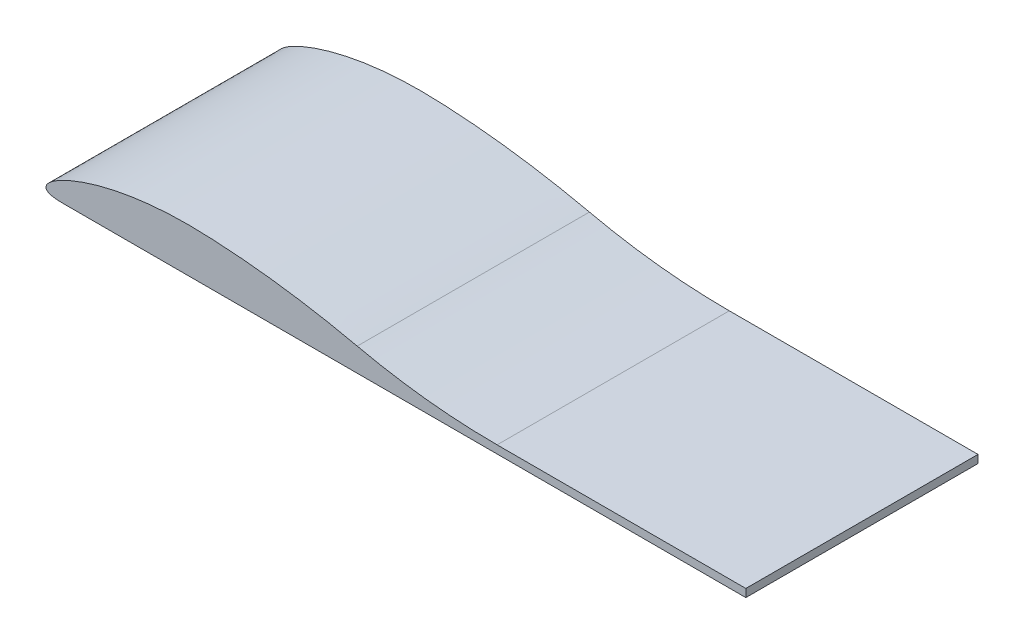
ISO-10303-21;
HEADER;
FILE_DESCRIPTION(('STEP AP214'),'2;1');
FILE_NAME('part.step','',(''),(''),'','','');
FILE_SCHEMA(('AUTOMOTIVE_DESIGN { 1 0 10303 214 1 1 1 1 }'));
ENDSEC;
DATA;
#1=APPLICATION_CONTEXT('core data for automotive mechanical design processes');
#2=APPLICATION_PROTOCOL_DEFINITION('international standard','automotive_design',2000,#1);
#3=PRODUCT_CONTEXT('',#1,'mechanical');
#4=PRODUCT('Part','Part','',(#3));
#5=PRODUCT_RELATED_PRODUCT_CATEGORY('part','',(#4));
#6=PRODUCT_DEFINITION_FORMATION('','',#4);
#7=PRODUCT_DEFINITION_CONTEXT('part definition',#1,'design');
#8=PRODUCT_DEFINITION('design','',#6,#7);
#9=PRODUCT_DEFINITION_SHAPE('','',#8);
#10=(LENGTH_UNIT() NAMED_UNIT(*) SI_UNIT(.MILLI.,.METRE.));
#11=(NAMED_UNIT(*) PLANE_ANGLE_UNIT() SI_UNIT($,.RADIAN.));
#12=(NAMED_UNIT(*) SI_UNIT($,.STERADIAN.) SOLID_ANGLE_UNIT());
#13=UNCERTAINTY_MEASURE_WITH_UNIT(LENGTH_MEASURE(1.E-05),#10,'distance_accuracy_value','');
#14=(GEOMETRIC_REPRESENTATION_CONTEXT(3) GLOBAL_UNCERTAINTY_ASSIGNED_CONTEXT((#13)) GLOBAL_UNIT_ASSIGNED_CONTEXT((#10,
#11,#12)) REPRESENTATION_CONTEXT('',''));
#15=CARTESIAN_POINT('',(0.,0.,0.));
#16=DIRECTION('',(0.,0.,1.));
#17=DIRECTION('',(1.,0.,0.));
#18=AXIS2_PLACEMENT_3D('',#15,#16,#17);
#19=CARTESIAN_POINT('',(0.,2.69535336919036,185.42));
#20=DIRECTION('',(0.,-1.,0.));
#21=DIRECTION('',(1.,0.,0.));
#22=AXIS2_PLACEMENT_3D('',#19,#20,#21);
#23=PLANE('',#22);
#24=DIRECTION('',(-1.,0.,0.));
#25=VECTOR('',#24,1.);
#26=CARTESIAN_POINT('',(0.,2.69535336919036,0.));
#27=LINE('',#26,#25);
#28=CARTESIAN_POINT('',(558.8,2.69535336919067,0.));
#29=VERTEX_POINT('',#28);
#30=CARTESIAN_POINT('',(360.180421151928,2.69535336919056,0.));
#31=VERTEX_POINT('',#30);
#32=EDGE_CURVE('E114',#29,#31,#27,.T.);
#33=ORIENTED_EDGE('',*,*,#32,.T.);
#34=DIRECTION('',(0.,0.,1.));
#35=VECTOR('',#34,1.);
#36=CARTESIAN_POINT('',(360.180421151928,2.69535336919056,185.42));
#37=LINE('',#36,#35);
#38=CARTESIAN_POINT('',(360.180421151928,2.69535336919056,185.42));
#39=VERTEX_POINT('',#38);
#40=EDGE_CURVE('E50',#31,#39,#37,.T.);
#41=ORIENTED_EDGE('',*,*,#40,.T.);
#42=DIRECTION('',(-1.,0.,0.));
#43=VECTOR('',#42,1.);
#44=CARTESIAN_POINT('',(0.,2.69535336919036,185.42));
#45=LINE('',#44,#43);
#46=CARTESIAN_POINT('',(558.8,2.69535336919067,185.42));
#47=VERTEX_POINT('',#46);
#48=EDGE_CURVE('E91',#47,#39,#45,.T.);
#49=ORIENTED_EDGE('',*,*,#48,.F.);
#50=DIRECTION('',(0.,0.,-1.));
#51=VECTOR('',#50,1.);
#52=CARTESIAN_POINT('',(558.8,2.69535336919067,185.42));
#53=LINE('',#52,#51);
#54=EDGE_CURVE('E107',#47,#29,#53,.T.);
#55=ORIENTED_EDGE('',*,*,#54,.T.);
#56=EDGE_LOOP('',(#33,#41,#49,#55));
#57=FACE_BOUND('',#56,.T.);
#58=ADVANCED_FACE('F35',(#57),#23,.F.);
#59=CARTESIAN_POINT('',(304.8,0.,185.42));
#60=CARTESIAN_POINT('',(304.806765113415,0.0297936907438,185.42));
#61=CARTESIAN_POINT('',(303.042265442166,0.505757681104882,185.42));
#62=CARTESIAN_POINT('',(301.260699107524,1.13128828679422,185.42));
#63=CARTESIAN_POINT('',(296.859481645383,2.43138214292342,185.42));
#64=CARTESIAN_POINT('',(291.428347563501,4.05950750692163,185.42));
#65=CARTESIAN_POINT('',(284.271481229636,6.10623828707882,185.42));
#66=CARTESIAN_POINT('',(275.759062516084,8.44101190552645,185.42));
#67=CARTESIAN_POINT('',(265.867595029522,11.0139121726236,185.42));
#68=CARTESIAN_POINT('',(254.72828410266,13.7239516275996,185.42));
#69=CARTESIAN_POINT('',(242.45219776627,16.501342019607,185.42));
#70=CARTESIAN_POINT('',(229.161916522714,19.2494538440017,185.42));
#71=CARTESIAN_POINT('',(215.002240334106,21.8918598082205,185.42));
#72=CARTESIAN_POINT('',(200.122077246214,24.3476644337164,185.42));
#73=CARTESIAN_POINT('',(184.681833301631,26.5449418917091,185.42));
#74=CARTESIAN_POINT('',(168.851714947921,28.4233907056108,185.42));
#75=CARTESIAN_POINT('',(152.808183208541,29.930661937332,185.42));
#76=CARTESIAN_POINT('',(136.726583628561,31.0048710051825,185.42));
#77=CARTESIAN_POINT('',(120.705050439528,31.6889083800929,185.42));
#78=CARTESIAN_POINT('',(104.91367571592,31.6961733177902,185.42));
#79=CARTESIAN_POINT('',(89.5648924045714,30.8862286831657,185.42));
#80=CARTESIAN_POINT('',(74.9378034426248,29.3709102924395,185.42));
#81=CARTESIAN_POINT('',(61.2207309550213,27.2233169079844,185.42));
#82=CARTESIAN_POINT('',(48.5867513337238,24.5540455106148,185.42));
#83=CARTESIAN_POINT('',(37.1861333906392,21.5011014723962,185.42));
#84=CARTESIAN_POINT('',(27.1552746614983,18.1970778873359,185.42));
#85=CARTESIAN_POINT('',(18.5969283006425,14.8044671458805,185.42));
#86=CARTESIAN_POINT('',(11.6063717286755,11.4360388322654,185.42));
#87=CARTESIAN_POINT('',(6.20537461581932,8.26316028915888,185.42));
#88=CARTESIAN_POINT('',(2.4620711553724,5.3102193566351,185.42));
#89=CARTESIAN_POINT('',(0.172825892274397,2.71807809904705,185.42));
#90=CARTESIAN_POINT('',(-0.366692026212387,-0.106725709936372,185.42));
#91=CARTESIAN_POINT('',(1.61853864418734,-2.17519153343636,185.42));
#92=CARTESIAN_POINT('',(4.90312913802598,-3.1117877974165,185.42));
#93=CARTESIAN_POINT('',(9.54050066961738,-3.65904451106276,185.42));
#94=CARTESIAN_POINT('',(15.6223250235567,-3.68468011379504,185.42));
#95=CARTESIAN_POINT('',(23.0877165309997,-3.30949507157914,185.42));
#96=CARTESIAN_POINT('',(31.8617424793389,-2.56072504363965,185.42));
#97=CARTESIAN_POINT('',(41.8437098749915,-1.53618962834286,185.42));
#98=CARTESIAN_POINT('',(52.9319861205823,-0.324549042889645,185.42));
#99=CARTESIAN_POINT('',(65.0085126482625,0.982737612858198,185.42));
#100=CARTESIAN_POINT('',(77.9641225568185,2.27751163277432,185.42));
#101=CARTESIAN_POINT('',(91.6740314858693,3.44660128053989,185.42));
#102=CARTESIAN_POINT('',(106.020407657375,4.41212483885966,185.42));
#103=CARTESIAN_POINT('',(120.95534562256,5.05177624345621,185.42));
#104=CARTESIAN_POINT('',(136.33914130998,5.41029723383236,185.42));
#105=CARTESIAN_POINT('',(152.007716340095,5.72933017095042,185.42));
#106=CARTESIAN_POINT('',(167.715786189237,5.89135553497832,185.42));
#107=CARTESIAN_POINT('',(183.286749282816,5.90781947795733,185.42));
#108=CARTESIAN_POINT('',(198.553027184666,5.75950083301546,185.42));
#109=CARTESIAN_POINT('',(213.347799024157,5.45737661505621,185.42));
#110=CARTESIAN_POINT('',(227.508384673819,5.01338248731081,185.42));
#111=CARTESIAN_POINT('',(240.877077650288,4.45854649480439,185.42));
#112=CARTESIAN_POINT('',(253.302348041566,3.81956254234677,185.42));
#113=CARTESIAN_POINT('',(264.636493620716,3.14064435260617,185.42));
#114=CARTESIAN_POINT('',(274.759317931257,2.45167335072776,185.42));
#115=CARTESIAN_POINT('',(283.511762664263,1.80333800911344,185.42));
#116=CARTESIAN_POINT('',(290.902443864489,1.20739442477992,185.42));
#117=CARTESIAN_POINT('',(296.536660630331,0.742433739926797,185.42));
#118=CARTESIAN_POINT('',(301.097723541562,0.310240549260641,185.42));
#119=CARTESIAN_POINT('',(302.984341567181,0.206591885939164,185.42));
#120=CARTESIAN_POINT('',(304.793276654245,-0.0296097451566188,185.42));
#121=CARTESIAN_POINT('',(304.8,0.,185.42));
#122=B_SPLINE_CURVE_WITH_KNOTS('',3,(#59,#60,#61,#62,#63,#64,#65,#66,#67,#68,#69,#70,#71,#72,
#73,#74,#75,#76,#77,#78,#79,#80,#81,#82,#83,#84,#85,#86,#87,#88,#89,#90,#91,#92,#93,#94,#95,#96,
#97,#98,#99,#100,#101,#102,#103,#104,#105,#106,#107,#108,#109,#110,#111,#112,#113,#114,#115,
#116,#117,#118,#119,#120,#121),.UNSPECIFIED.,.T.,.F.,(4,1,1,1,1,1,1,1,1,1,1,1,1,1,1,1,1,1,1,1,1,
1,1,1,1,1,1,1,1,1,1,1,1,1,1,1,1,1,1,1,1,1,1,1,1,1,1,1,1,1,1,1,1,1,1,1,1,1,1,1,4),(0.,
0.00137455348322331,0.00548449728179396,0.0122733609908927,0.021682195504866,0.0335806119079948,
0.0478307427867091,0.0643059527211734,0.082777332043007,0.103063756455997,0.124929016786915,
0.148149110667858,0.172444694611559,0.197572105868171,0.223268880537162,0.249227774933554,
0.275186209349679,0.300900708934774,0.326462938278696,0.351222485186767,0.374905858971967,
0.397269706218861,0.418072413969665,0.437079533175026,0.454093093767394,0.468919631578705,
0.48139171235289,0.491447126518173,0.499023571234557,0.504293734329401,0.507921918342,
0.511539686153778,0.516780527527172,0.524216490268905,0.533991629403711,0.546033957270731,
0.560220284382465,0.576403357410148,0.594370816485922,0.613951103581465,0.634916884969972,
0.657088503485648,0.680229909573905,0.704175481107386,0.72909036740664,0.754353775526935,
0.779667752347888,0.804760119952374,0.829359338708984,0.853208710008459,0.876041363199166,
0.897604065496152,0.917662212410958,0.935969860405553,0.952309787739252,0.966502759006892,
0.978350082728452,0.987731492337842,0.994510920242662,0.998633932979557,1.),.UNSPECIFIED.);
#123=DIRECTION('',(0.,0.,-1.));
#124=VECTOR('',#123,1.);
#125=SURFACE_OF_LINEAR_EXTRUSION('',#122,#124);
#126=CARTESIAN_POINT('',(248.468052126159,15.1306788748813,185.42));
#127=VERTEX_POINT('',#126);
#128=CARTESIAN_POINT('',(13.1611152527335,-3.65464663080947,185.42));
#129=VERTEX_POINT('',#128);
#130=EDGE_CURVE('E81',#127,#129,#122,.T.);
#131=ORIENTED_EDGE('',*,*,#130,.F.);
#132=DIRECTION('',(0.,0.,-1.));
#133=VECTOR('',#132,1.);
#134=CARTESIAN_POINT('',(248.468052126159,15.1306788748814,185.42));
#135=LINE('',#134,#133);
#136=CARTESIAN_POINT('',(248.468052126159,15.1306788748813,0.));
#137=VERTEX_POINT('',#136);
#138=EDGE_CURVE('E99',#127,#137,#135,.T.);
#139=ORIENTED_EDGE('',*,*,#138,.T.);
#140=CARTESIAN_POINT('',(304.8,0.,0.));
#141=CARTESIAN_POINT('',(304.806765113415,0.0297936907438,0.));
#142=CARTESIAN_POINT('',(303.042265442166,0.505757681104882,0.));
#143=CARTESIAN_POINT('',(301.260699107524,1.13128828679422,0.));
#144=CARTESIAN_POINT('',(296.859481645383,2.43138214292342,0.));
#145=CARTESIAN_POINT('',(291.428347563501,4.05950750692163,0.));
#146=CARTESIAN_POINT('',(284.271481229636,6.10623828707882,0.));
#147=CARTESIAN_POINT('',(275.759062516084,8.44101190552645,0.));
#148=CARTESIAN_POINT('',(265.867595029522,11.0139121726236,0.));
#149=CARTESIAN_POINT('',(254.72828410266,13.7239516275996,0.));
#150=CARTESIAN_POINT('',(242.45219776627,16.501342019607,0.));
#151=CARTESIAN_POINT('',(229.161916522714,19.2494538440017,0.));
#152=CARTESIAN_POINT('',(215.002240334106,21.8918598082205,0.));
#153=CARTESIAN_POINT('',(200.122077246214,24.3476644337164,0.));
#154=CARTESIAN_POINT('',(184.681833301631,26.5449418917091,0.));
#155=CARTESIAN_POINT('',(168.851714947921,28.4233907056108,0.));
#156=CARTESIAN_POINT('',(152.808183208541,29.930661937332,0.));
#157=CARTESIAN_POINT('',(136.726583628561,31.0048710051825,0.));
#158=CARTESIAN_POINT('',(120.705050439528,31.6889083800929,0.));
#159=CARTESIAN_POINT('',(104.91367571592,31.6961733177902,0.));
#160=CARTESIAN_POINT('',(89.5648924045714,30.8862286831657,0.));
#161=CARTESIAN_POINT('',(74.9378034426248,29.3709102924395,0.));
#162=CARTESIAN_POINT('',(61.2207309550213,27.2233169079844,0.));
#163=CARTESIAN_POINT('',(48.5867513337238,24.5540455106148,0.));
#164=CARTESIAN_POINT('',(37.1861333906392,21.5011014723962,0.));
#165=CARTESIAN_POINT('',(27.1552746614983,18.1970778873359,0.));
#166=CARTESIAN_POINT('',(18.5969283006425,14.8044671458805,0.));
#167=CARTESIAN_POINT('',(11.6063717286755,11.4360388322654,0.));
#168=CARTESIAN_POINT('',(6.20537461581932,8.26316028915888,0.));
#169=CARTESIAN_POINT('',(2.4620711553724,5.3102193566351,0.));
#170=CARTESIAN_POINT('',(0.172825892274397,2.71807809904705,0.));
#171=CARTESIAN_POINT('',(-0.366692026212387,-0.106725709936372,0.));
#172=CARTESIAN_POINT('',(1.61853864418734,-2.17519153343636,0.));
#173=CARTESIAN_POINT('',(4.90312913802598,-3.1117877974165,0.));
#174=CARTESIAN_POINT('',(9.54050066961738,-3.65904451106276,0.));
#175=CARTESIAN_POINT('',(15.6223250235567,-3.68468011379504,0.));
#176=CARTESIAN_POINT('',(23.0877165309997,-3.30949507157914,0.));
#177=CARTESIAN_POINT('',(31.8617424793389,-2.56072504363965,0.));
#178=CARTESIAN_POINT('',(41.8437098749915,-1.53618962834286,0.));
#179=CARTESIAN_POINT('',(52.9319861205823,-0.324549042889645,0.));
#180=CARTESIAN_POINT('',(65.0085126482625,0.982737612858198,0.));
#181=CARTESIAN_POINT('',(77.9641225568185,2.27751163277432,0.));
#182=CARTESIAN_POINT('',(91.6740314858693,3.44660128053989,0.));
#183=CARTESIAN_POINT('',(106.020407657375,4.41212483885966,0.));
#184=CARTESIAN_POINT('',(120.95534562256,5.05177624345621,0.));
#185=CARTESIAN_POINT('',(136.33914130998,5.41029723383236,0.));
#186=CARTESIAN_POINT('',(152.007716340095,5.72933017095042,0.));
#187=CARTESIAN_POINT('',(167.715786189237,5.89135553497832,0.));
#188=CARTESIAN_POINT('',(183.286749282816,5.90781947795733,0.));
#189=CARTESIAN_POINT('',(198.553027184666,5.75950083301546,0.));
#190=CARTESIAN_POINT('',(213.347799024157,5.45737661505621,0.));
#191=CARTESIAN_POINT('',(227.508384673819,5.01338248731081,0.));
#192=CARTESIAN_POINT('',(240.877077650288,4.45854649480439,0.));
#193=CARTESIAN_POINT('',(253.302348041566,3.81956254234677,0.));
#194=CARTESIAN_POINT('',(264.636493620716,3.14064435260617,0.));
#195=CARTESIAN_POINT('',(274.759317931257,2.45167335072776,0.));
#196=CARTESIAN_POINT('',(283.511762664263,1.80333800911344,0.));
#197=CARTESIAN_POINT('',(290.902443864489,1.20739442477992,0.));
#198=CARTESIAN_POINT('',(296.536660630331,0.742433739926797,0.));
#199=CARTESIAN_POINT('',(301.097723541562,0.310240549260641,0.));
#200=CARTESIAN_POINT('',(302.984341567181,0.206591885939164,0.));
#201=CARTESIAN_POINT('',(304.793276654245,-0.0296097451566188,0.));
#202=CARTESIAN_POINT('',(304.8,0.,0.));
#203=B_SPLINE_CURVE_WITH_KNOTS('',3,(#140,#141,#142,#143,#144,#145,#146,#147,#148,#149,#150,
#151,#152,#153,#154,#155,#156,#157,#158,#159,#160,#161,#162,#163,#164,#165,#166,#167,#168,#169,
#170,#171,#172,#173,#174,#175,#176,#177,#178,#179,#180,#181,#182,#183,#184,#185,#186,#187,#188,
#189,#190,#191,#192,#193,#194,#195,#196,#197,#198,#199,#200,#201,#202),.UNSPECIFIED.,.T.,.F.,(4,
1,1,1,1,1,1,1,1,1,1,1,1,1,1,1,1,1,1,1,1,1,1,1,1,1,1,1,1,1,1,1,1,1,1,1,1,1,1,1,1,1,1,1,1,1,1,1,1,
1,1,1,1,1,1,1,1,1,1,1,4),(0.,0.00137455348322331,0.00548449728179396,0.0122733609908927,
0.021682195504866,0.0335806119079948,0.0478307427867091,0.0643059527211734,0.082777332043007,
0.103063756455997,0.124929016786915,0.148149110667858,0.172444694611559,0.197572105868171,
0.223268880537162,0.249227774933554,0.275186209349679,0.300900708934774,0.326462938278696,
0.351222485186767,0.374905858971967,0.397269706218861,0.418072413969665,0.437079533175026,
0.454093093767394,0.468919631578705,0.48139171235289,0.491447126518173,0.499023571234557,
0.504293734329401,0.507921918342,0.511539686153778,0.516780527527172,0.524216490268905,
0.533991629403711,0.546033957270731,0.560220284382465,0.576403357410148,0.594370816485922,
0.613951103581465,0.634916884969972,0.657088503485648,0.680229909573905,0.704175481107386,
0.72909036740664,0.754353775526935,0.779667752347888,0.804760119952374,0.829359338708984,
0.853208710008459,0.876041363199166,0.897604065496152,0.917662212410958,0.935969860405553,
0.952309787739252,0.966502759006892,0.978350082728452,0.987731492337842,0.994510920242662,
0.998633932979557,1.),.UNSPECIFIED.);
#204=CARTESIAN_POINT('',(13.1611152527335,-3.65464663080947,0.));
#205=VERTEX_POINT('',#204);
#206=EDGE_CURVE('E96',#137,#205,#203,.T.);
#207=ORIENTED_EDGE('',*,*,#206,.T.);
#208=DIRECTION('',(0.,0.,-1.));
#209=VECTOR('',#208,1.);
#210=CARTESIAN_POINT('',(13.1611152527335,-3.65464663080947,185.42));
#211=LINE('',#210,#209);
#212=EDGE_CURVE('E94',#129,#205,#211,.T.);
#213=ORIENTED_EDGE('',*,*,#212,.F.);
#214=EDGE_LOOP('',(#131,#139,#207,#213));
#215=FACE_BOUND('',#214,.T.);
#216=ADVANCED_FACE('F95',(#215),#125,.F.);
#217=CARTESIAN_POINT('',(0.,-3.65464663080947,185.42));
#218=DIRECTION('',(0.,1.,0.));
#219=DIRECTION('',(-1.,0.,0.));
#220=AXIS2_PLACEMENT_3D('',#217,#218,#219);
#221=PLANE('',#220);
#222=DIRECTION('',(1.,0.,0.));
#223=VECTOR('',#222,1.);
#224=CARTESIAN_POINT('',(0.,-3.65464663080947,0.));
#225=LINE('',#224,#223);
#226=CARTESIAN_POINT('',(558.8,-3.65464663080933,0.));
#227=VERTEX_POINT('',#226);
#228=EDGE_CURVE('E119',#205,#227,#225,.T.);
#229=ORIENTED_EDGE('',*,*,#228,.T.);
#230=DIRECTION('',(0.,0.,-1.));
#231=VECTOR('',#230,1.);
#232=CARTESIAN_POINT('',(558.8,-3.65464663080933,185.42));
#233=LINE('',#232,#231);
#234=CARTESIAN_POINT('',(558.8,-3.65464663080933,185.42));
#235=VERTEX_POINT('',#234);
#236=EDGE_CURVE('E100',#235,#227,#233,.T.);
#237=ORIENTED_EDGE('',*,*,#236,.F.);
#238=DIRECTION('',(1.,0.,0.));
#239=VECTOR('',#238,1.);
#240=CARTESIAN_POINT('',(0.,-3.65464663080947,185.42));
#241=LINE('',#240,#239);
#242=EDGE_CURVE('E85',#129,#235,#241,.T.);
#243=ORIENTED_EDGE('',*,*,#242,.F.);
#244=ORIENTED_EDGE('',*,*,#212,.T.);
#245=EDGE_LOOP('',(#229,#237,#243,#244));
#246=FACE_BOUND('',#245,.T.);
#247=ADVANCED_FACE('F102',(#246),#221,.F.);
#248=CARTESIAN_POINT('',(558.8,0.,185.42));
#249=DIRECTION('',(-1.,0.,0.));
#250=DIRECTION('',(0.,0.,1.));
#251=AXIS2_PLACEMENT_3D('',#248,#249,#250);
#252=PLANE('',#251);
#253=DIRECTION('',(0.,1.,0.));
#254=VECTOR('',#253,1.);
#255=CARTESIAN_POINT('',(558.8,0.,0.));
#256=LINE('',#255,#254);
#257=EDGE_CURVE('E124',#227,#29,#256,.T.);
#258=ORIENTED_EDGE('',*,*,#257,.T.);
#259=ORIENTED_EDGE('',*,*,#54,.F.);
#260=DIRECTION('',(0.,1.,0.));
#261=VECTOR('',#260,1.);
#262=CARTESIAN_POINT('',(558.8,0.,185.42));
#263=LINE('',#262,#261);
#264=EDGE_CURVE('E105',#235,#47,#263,.T.);
#265=ORIENTED_EDGE('',*,*,#264,.F.);
#266=ORIENTED_EDGE('',*,*,#236,.T.);
#267=EDGE_LOOP('',(#258,#259,#265,#266));
#268=FACE_BOUND('',#267,.T.);
#269=ADVANCED_FACE('F134',(#268),#252,.F.);
#270=CARTESIAN_POINT('',(0.,0.,185.42));
#271=DIRECTION('',(0.,0.,1.));
#272=DIRECTION('',(1.,0.,0.));
#273=AXIS2_PLACEMENT_3D('',#270,#271,#272);
#274=PLANE('',#273);
#275=ORIENTED_EDGE('',*,*,#48,.T.);
#276=CARTESIAN_POINT('',(360.180421151928,510.69535336919,185.42));
#277=DIRECTION('',(0.,0.,1.));
#278=DIRECTION('',(1.,0.,0.));
#279=AXIS2_PLACEMENT_3D('',#276,#277,#278);
#280=CIRCLE('',#279,508.);
#281=EDGE_CURVE('E11',#39,#127,#280,.F.);
#282=ORIENTED_EDGE('',*,*,#281,.T.);
#283=ORIENTED_EDGE('',*,*,#130,.T.);
#284=ORIENTED_EDGE('',*,*,#242,.T.);
#285=ORIENTED_EDGE('',*,*,#264,.T.);
#286=EDGE_LOOP('',(#275,#282,#283,#284,#285));
#287=FACE_BOUND('',#286,.T.);
#288=ADVANCED_FACE('F83',(#287),#274,.T.);
#289=CARTESIAN_POINT('',(0.,0.,0.));
#290=DIRECTION('',(0.,0.,1.));
#291=DIRECTION('',(1.,0.,0.));
#292=AXIS2_PLACEMENT_3D('',#289,#290,#291);
#293=PLANE('',#292);
#294=ORIENTED_EDGE('',*,*,#32,.F.);
#295=ORIENTED_EDGE('',*,*,#257,.F.);
#296=ORIENTED_EDGE('',*,*,#228,.F.);
#297=ORIENTED_EDGE('',*,*,#206,.F.);
#298=CARTESIAN_POINT('',(360.180421151928,510.69535336919,0.));
#299=DIRECTION('',(0.,0.,1.));
#300=DIRECTION('',(1.,0.,0.));
#301=AXIS2_PLACEMENT_3D('',#298,#299,#300);
#302=CIRCLE('',#301,508.);
#303=EDGE_CURVE('E43',#137,#31,#302,.T.);
#304=ORIENTED_EDGE('',*,*,#303,.T.);
#305=EDGE_LOOP('',(#294,#295,#296,#297,#304));
#306=FACE_BOUND('',#305,.T.);
#307=ADVANCED_FACE('F131',(#306),#293,.F.);
#308=CARTESIAN_POINT('',(360.180421151928,510.69535336919,92.71));
#309=DIRECTION('',(0.,0.,-1.));
#310=DIRECTION('',(-1.,0.,0.));
#311=AXIS2_PLACEMENT_3D('',#308,#309,#310);
#312=CYLINDRICAL_SURFACE('',#311,508.);
#313=ORIENTED_EDGE('',*,*,#281,.F.);
#314=ORIENTED_EDGE('',*,*,#40,.F.);
#315=ORIENTED_EDGE('',*,*,#303,.F.);
#316=ORIENTED_EDGE('',*,*,#138,.F.);
#317=EDGE_LOOP('',(#313,#314,#315,#316));
#318=FACE_BOUND('',#317,.T.);
#319=ADVANCED_FACE('F37',(#318),#312,.F.);
#320=CLOSED_SHELL('',(#58,#216,#247,#269,#288,#307,#319));
#321=MANIFOLD_SOLID_BREP('B2',#320);
#322=ADVANCED_BREP_SHAPE_REPRESENTATION('',(#18,#321),#14);
#323=SHAPE_DEFINITION_REPRESENTATION(#9,#322);
ENDSEC;
END-ISO-10303-21;
